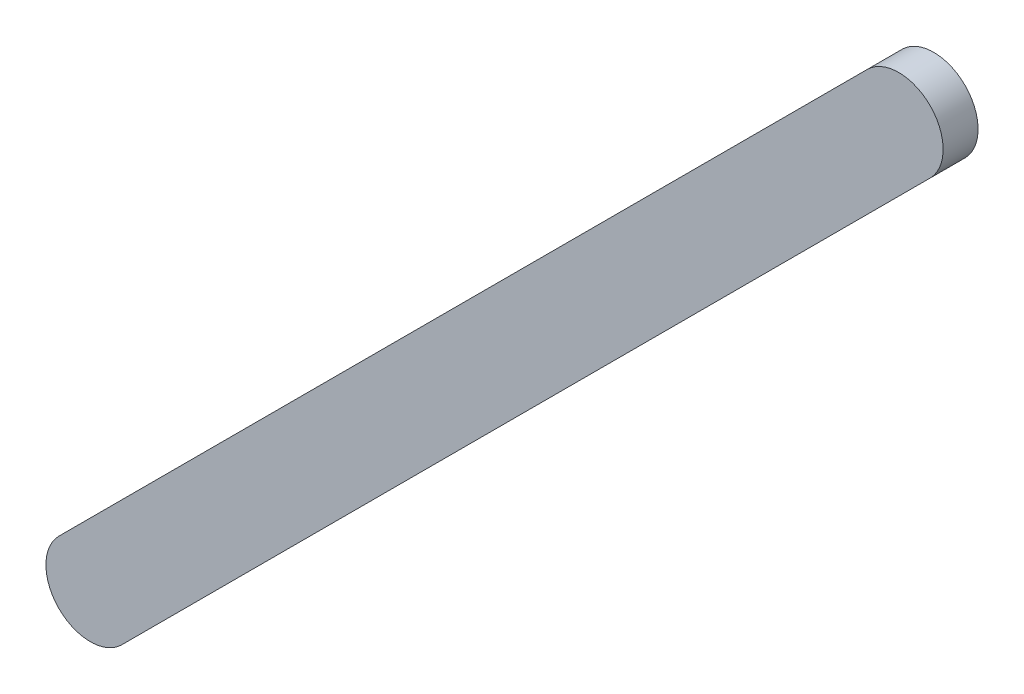
ISO-10303-21;
HEADER;
FILE_DESCRIPTION(('STEP AP214'),'2;1');
FILE_NAME('part.step','',(''),(''),'','','');
FILE_SCHEMA(('AUTOMOTIVE_DESIGN { 1 0 10303 214 1 1 1 1 }'));
ENDSEC;
DATA;
#1=APPLICATION_CONTEXT('core data for automotive mechanical design processes');
#2=APPLICATION_PROTOCOL_DEFINITION('international standard','automotive_design',2000,#1);
#3=PRODUCT_CONTEXT('',#1,'mechanical');
#4=PRODUCT('Part','Part','',(#3));
#5=PRODUCT_RELATED_PRODUCT_CATEGORY('part','',(#4));
#6=PRODUCT_DEFINITION_FORMATION('','',#4);
#7=PRODUCT_DEFINITION_CONTEXT('part definition',#1,'design');
#8=PRODUCT_DEFINITION('design','',#6,#7);
#9=PRODUCT_DEFINITION_SHAPE('','',#8);
#10=(LENGTH_UNIT() NAMED_UNIT(*) SI_UNIT(.MILLI.,.METRE.));
#11=(NAMED_UNIT(*) PLANE_ANGLE_UNIT() SI_UNIT($,.RADIAN.));
#12=(NAMED_UNIT(*) SI_UNIT($,.STERADIAN.) SOLID_ANGLE_UNIT());
#13=UNCERTAINTY_MEASURE_WITH_UNIT(LENGTH_MEASURE(1.E-05),#10,'distance_accuracy_value','');
#14=(GEOMETRIC_REPRESENTATION_CONTEXT(3) GLOBAL_UNCERTAINTY_ASSIGNED_CONTEXT((#13)) GLOBAL_UNIT_ASSIGNED_CONTEXT((#10,
#11,#12)) REPRESENTATION_CONTEXT('',''));
#15=CARTESIAN_POINT('',(0.,0.,0.));
#16=DIRECTION('',(0.,0.,1.));
#17=DIRECTION('',(1.,0.,0.));
#18=AXIS2_PLACEMENT_3D('',#15,#16,#17);
#19=CARTESIAN_POINT('',(138.8098062,80.58939686,0.));
#20=DIRECTION('',(-0.707106781186548,0.707106781186548,0.));
#21=DIRECTION('',(0.707106781186548,0.707106781186548,0.));
#22=AXIS2_PLACEMENT_3D('',#19,#20,#21);
#23=PLANE('',#22);
#24=DIRECTION('',(0.707106781186548,0.707106781186548,0.));
#25=VECTOR('',#24,1.);
#26=CARTESIAN_POINT('',(138.8098062,80.58939686,0.1999996));
#27=LINE('',#26,#25);
#28=CARTESIAN_POINT('',(138.8098062,80.58939686,0.1999996));
#29=VERTEX_POINT('',#28);
#30=CARTESIAN_POINT('',(143.43560594,85.2151966,0.1999996));
#31=VERTEX_POINT('',#30);
#32=EDGE_CURVE('E11',#29,#31,#27,.T.);
#33=ORIENTED_EDGE('',*,*,#32,.F.);
#34=DIRECTION('',(0.,0.,1.));
#35=VECTOR('',#34,1.);
#36=CARTESIAN_POINT('',(138.8098062,80.58939686,0.));
#37=LINE('',#36,#35);
#38=CARTESIAN_POINT('',(138.8098062,80.58939686,0.));
#39=VERTEX_POINT('',#38);
#40=EDGE_CURVE('E24',#39,#29,#37,.T.);
#41=ORIENTED_EDGE('',*,*,#40,.F.);
#42=DIRECTION('',(0.707106781186548,0.707106781186548,0.));
#43=VECTOR('',#42,1.);
#44=CARTESIAN_POINT('',(138.8098062,80.58939686,0.));
#45=LINE('',#44,#43);
#46=CARTESIAN_POINT('',(143.43560594,85.2151966,0.));
#47=VERTEX_POINT('',#46);
#48=EDGE_CURVE('E75',#39,#47,#45,.T.);
#49=ORIENTED_EDGE('',*,*,#48,.T.);
#50=DIRECTION('',(0.,0.,1.));
#51=VECTOR('',#50,1.);
#52=CARTESIAN_POINT('',(143.43560594,85.2151966,0.));
#53=LINE('',#52,#51);
#54=EDGE_CURVE('E37',#47,#31,#53,.T.);
#55=ORIENTED_EDGE('',*,*,#54,.T.);
#56=EDGE_LOOP('',(#33,#41,#49,#55));
#57=FACE_BOUND('',#56,.T.);
#58=ADVANCED_FACE('F17',(#57),#23,.F.);
#59=CARTESIAN_POINT('',(143.25600127,85.39480127,0.));
#60=DIRECTION('',(0.,0.,-1.));
#61=DIRECTION('',(0.70710678118652,-0.707106781186576,0.));
#62=AXIS2_PLACEMENT_3D('',#59,#60,#61);
#63=CYLINDRICAL_SURFACE('',#62,0.253999360179532);
#64=CARTESIAN_POINT('',(143.25600127,85.39480127,0.1999996));
#65=DIRECTION('',(0.,0.,1.));
#66=DIRECTION('',(0.70710678118652,-0.707106781186576,0.));
#67=AXIS2_PLACEMENT_3D('',#64,#65,#66);
#68=CIRCLE('',#67,0.253999360179532);
#69=CARTESIAN_POINT('',(143.0763966,85.57440594,0.1999996));
#70=VERTEX_POINT('',#69);
#71=EDGE_CURVE('E83',#31,#70,#68,.T.);
#72=ORIENTED_EDGE('',*,*,#71,.F.);
#73=ORIENTED_EDGE('',*,*,#54,.F.);
#74=CARTESIAN_POINT('',(143.25600127,85.39480127,0.));
#75=DIRECTION('',(0.,0.,1.));
#76=DIRECTION('',(0.70710678118652,-0.707106781186576,0.));
#77=AXIS2_PLACEMENT_3D('',#74,#75,#76);
#78=CIRCLE('',#77,0.253999360179532);
#79=CARTESIAN_POINT('',(143.0763966,85.57440594,0.));
#80=VERTEX_POINT('',#79);
#81=EDGE_CURVE('E81',#47,#80,#78,.T.);
#82=ORIENTED_EDGE('',*,*,#81,.T.);
#83=DIRECTION('',(0.,0.,1.));
#84=VECTOR('',#83,1.);
#85=CARTESIAN_POINT('',(143.0763966,85.57440594,0.));
#86=LINE('',#85,#84);
#87=EDGE_CURVE('E67',#80,#70,#86,.T.);
#88=ORIENTED_EDGE('',*,*,#87,.T.);
#89=EDGE_LOOP('',(#72,#73,#82,#88));
#90=FACE_BOUND('',#89,.T.);
#91=ADVANCED_FACE('F89',(#90),#63,.T.);
#92=CARTESIAN_POINT('',(143.0763966,85.57440594,0.));
#93=DIRECTION('',(0.707106781186546,-0.707106781186549,0.));
#94=DIRECTION('',(-0.707106781186549,-0.707106781186546,0.));
#95=AXIS2_PLACEMENT_3D('',#92,#93,#94);
#96=PLANE('',#95);
#97=DIRECTION('',(-0.707106781186549,-0.707106781186546,0.));
#98=VECTOR('',#97,1.);
#99=CARTESIAN_POINT('',(143.0763966,85.57440594,0.1999996));
#100=LINE('',#99,#98);
#101=CARTESIAN_POINT('',(138.45059686,80.9486062,0.1999996));
#102=VERTEX_POINT('',#101);
#103=EDGE_CURVE('E71',#70,#102,#100,.T.);
#104=ORIENTED_EDGE('',*,*,#103,.F.);
#105=ORIENTED_EDGE('',*,*,#87,.F.);
#106=DIRECTION('',(-0.707106781186549,-0.707106781186546,0.));
#107=VECTOR('',#106,1.);
#108=CARTESIAN_POINT('',(143.0763966,85.57440594,0.));
#109=LINE('',#108,#107);
#110=CARTESIAN_POINT('',(138.45059686,80.9486062,0.));
#111=VERTEX_POINT('',#110);
#112=EDGE_CURVE('E63',#80,#111,#109,.T.);
#113=ORIENTED_EDGE('',*,*,#112,.T.);
#114=DIRECTION('',(0.,0.,1.));
#115=VECTOR('',#114,1.);
#116=CARTESIAN_POINT('',(138.45059686,80.9486062,0.));
#117=LINE('',#116,#115);
#118=EDGE_CURVE('E53',#111,#102,#117,.T.);
#119=ORIENTED_EDGE('',*,*,#118,.T.);
#120=EDGE_LOOP('',(#104,#105,#113,#119));
#121=FACE_BOUND('',#120,.T.);
#122=ADVANCED_FACE('F66',(#121),#96,.F.);
#123=CARTESIAN_POINT('',(138.63020153,80.76900153,0.));
#124=DIRECTION('',(0.,0.,-1.));
#125=DIRECTION('',(-0.707106781186576,0.70710678118652,0.));
#126=AXIS2_PLACEMENT_3D('',#123,#124,#125);
#127=CYLINDRICAL_SURFACE('',#126,0.253999360179539);
#128=CARTESIAN_POINT('',(138.63020153,80.76900153,0.1999996));
#129=DIRECTION('',(0.,0.,1.));
#130=DIRECTION('',(-0.707106781186576,0.70710678118652,0.));
#131=AXIS2_PLACEMENT_3D('',#128,#129,#130);
#132=CIRCLE('',#131,0.253999360179539);
#133=EDGE_CURVE('E59',#102,#29,#132,.T.);
#134=ORIENTED_EDGE('',*,*,#133,.F.);
#135=ORIENTED_EDGE('',*,*,#118,.F.);
#136=CARTESIAN_POINT('',(138.63020153,80.76900153,0.));
#137=DIRECTION('',(0.,0.,1.));
#138=DIRECTION('',(-0.707106781186576,0.70710678118652,0.));
#139=AXIS2_PLACEMENT_3D('',#136,#137,#138);
#140=CIRCLE('',#139,0.253999360179539);
#141=EDGE_CURVE('E57',#111,#39,#140,.T.);
#142=ORIENTED_EDGE('',*,*,#141,.T.);
#143=ORIENTED_EDGE('',*,*,#40,.T.);
#144=EDGE_LOOP('',(#134,#135,#142,#143));
#145=FACE_BOUND('',#144,.T.);
#146=ADVANCED_FACE('F55',(#145),#127,.T.);
#147=CARTESIAN_POINT('',(138.8098062,80.58939686,0.));
#148=DIRECTION('',(0.,0.,-1.));
#149=DIRECTION('',(-1.,0.,0.));
#150=AXIS2_PLACEMENT_3D('',#147,#148,#149);
#151=PLANE('',#150);
#152=ORIENTED_EDGE('',*,*,#141,.F.);
#153=ORIENTED_EDGE('',*,*,#112,.F.);
#154=ORIENTED_EDGE('',*,*,#81,.F.);
#155=ORIENTED_EDGE('',*,*,#48,.F.);
#156=EDGE_LOOP('',(#152,#153,#154,#155));
#157=FACE_BOUND('',#156,.T.);
#158=ADVANCED_FACE('F74',(#157),#151,.T.);
#159=CARTESIAN_POINT('',(138.8098062,80.58939686,0.1999996));
#160=DIRECTION('',(0.,0.,-1.));
#161=DIRECTION('',(-1.,0.,0.));
#162=AXIS2_PLACEMENT_3D('',#159,#160,#161);
#163=PLANE('',#162);
#164=ORIENTED_EDGE('',*,*,#32,.T.);
#165=ORIENTED_EDGE('',*,*,#71,.T.);
#166=ORIENTED_EDGE('',*,*,#103,.T.);
#167=ORIENTED_EDGE('',*,*,#133,.T.);
#168=EDGE_LOOP('',(#164,#165,#166,#167));
#169=FACE_BOUND('',#168,.T.);
#170=ADVANCED_FACE('F91',(#169),#163,.F.);
#171=CLOSED_SHELL('',(#58,#91,#122,#146,#158,#170));
#172=MANIFOLD_SOLID_BREP('B1',#171);
#173=ADVANCED_BREP_SHAPE_REPRESENTATION('',(#18,#172),#14);
#174=SHAPE_DEFINITION_REPRESENTATION(#9,#173);
ENDSEC;
END-ISO-10303-21;
